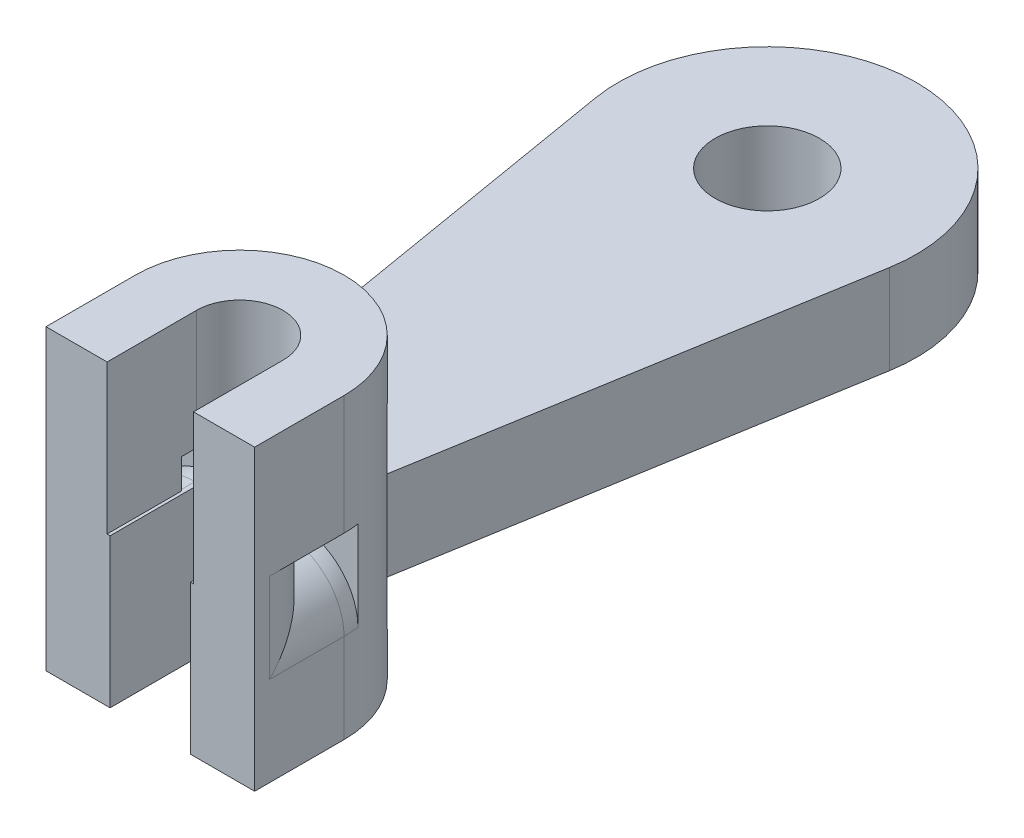
ISO-10303-21;
HEADER;
FILE_DESCRIPTION(('STEP AP214'),'2;1');
FILE_NAME('part.step','',(''),(''),'','','');
FILE_SCHEMA(('AUTOMOTIVE_DESIGN { 1 0 10303 214 1 1 1 1 }'));
ENDSEC;
DATA;
#1=APPLICATION_CONTEXT('core data for automotive mechanical design processes');
#2=APPLICATION_PROTOCOL_DEFINITION('international standard','automotive_design',2000,#1);
#3=PRODUCT_CONTEXT('',#1,'mechanical');
#4=PRODUCT('Part','Part','',(#3));
#5=PRODUCT_RELATED_PRODUCT_CATEGORY('part','',(#4));
#6=PRODUCT_DEFINITION_FORMATION('','',#4);
#7=PRODUCT_DEFINITION_CONTEXT('part definition',#1,'design');
#8=PRODUCT_DEFINITION('design','',#6,#7);
#9=PRODUCT_DEFINITION_SHAPE('','',#8);
#10=(LENGTH_UNIT() NAMED_UNIT(*) SI_UNIT(.MILLI.,.METRE.));
#11=(NAMED_UNIT(*) PLANE_ANGLE_UNIT() SI_UNIT($,.RADIAN.));
#12=(NAMED_UNIT(*) SI_UNIT($,.STERADIAN.) SOLID_ANGLE_UNIT());
#13=UNCERTAINTY_MEASURE_WITH_UNIT(LENGTH_MEASURE(1.E-05),#10,'distance_accuracy_value','');
#14=(GEOMETRIC_REPRESENTATION_CONTEXT(3) GLOBAL_UNCERTAINTY_ASSIGNED_CONTEXT((#13)) GLOBAL_UNIT_ASSIGNED_CONTEXT((#10,
#11,#12)) REPRESENTATION_CONTEXT('',''));
#15=CARTESIAN_POINT('',(0.,0.,0.));
#16=DIRECTION('',(0.,0.,1.));
#17=DIRECTION('',(1.,0.,0.));
#18=AXIS2_PLACEMENT_3D('',#15,#16,#17);
#19=CARTESIAN_POINT('',(0.,5.,0.));
#20=DIRECTION('',(0.,-1.,0.));
#21=DIRECTION('',(0.,0.,-1.));
#22=AXIS2_PLACEMENT_3D('',#19,#20,#21);
#23=CYLINDRICAL_SURFACE('',#22,3.5);
#24=DIRECTION('',(0.,-1.,0.));
#25=VECTOR('',#24,1.);
#26=CARTESIAN_POINT('',(3.46410161513775,5.,-0.500000000000001));
#27=LINE('',#26,#25);
#28=CARTESIAN_POINT('',(3.46410161513775,6.,-0.5));
#29=VERTEX_POINT('',#28);
#30=CARTESIAN_POINT('',(3.46410161513775,3.,-0.500000000000001));
#31=VERTEX_POINT('',#30);
#32=EDGE_CURVE('E321',#29,#31,#27,.T.);
#33=ORIENTED_EDGE('',*,*,#32,.T.);
#34=CARTESIAN_POINT('',(0.,3.,0.));
#35=DIRECTION('',(0.,1.,0.));
#36=DIRECTION('',(0.,0.,1.));
#37=AXIS2_PLACEMENT_3D('',#34,#35,#36);
#38=CIRCLE('',#37,3.5);
#39=CARTESIAN_POINT('',(3.5,3.,0.));
#40=VERTEX_POINT('',#39);
#41=EDGE_CURVE('E509',#31,#40,#38,.F.);
#42=ORIENTED_EDGE('',*,*,#41,.T.);
#43=DIRECTION('',(0.,-1.,0.));
#44=VECTOR('',#43,1.);
#45=CARTESIAN_POINT('',(3.5,5.,0.));
#46=LINE('',#45,#44);
#47=CARTESIAN_POINT('',(3.5,0.,0.));
#48=VERTEX_POINT('',#47);
#49=EDGE_CURVE('E439',#40,#48,#46,.T.);
#50=ORIENTED_EDGE('',*,*,#49,.T.);
#51=CARTESIAN_POINT('',(0.,0.,0.));
#52=DIRECTION('',(0.,1.,0.));
#53=DIRECTION('',(0.,0.,1.));
#54=AXIS2_PLACEMENT_3D('',#51,#52,#53);
#55=CIRCLE('',#54,3.5);
#56=CARTESIAN_POINT('',(-3.5,0.,0.));
#57=VERTEX_POINT('',#56);
#58=EDGE_CURVE('E411',#48,#57,#55,.T.);
#59=ORIENTED_EDGE('',*,*,#58,.T.);
#60=DIRECTION('',(0.,-1.,0.));
#61=VECTOR('',#60,1.);
#62=CARTESIAN_POINT('',(-3.5,5.,0.));
#63=LINE('',#62,#61);
#64=CARTESIAN_POINT('',(-3.5,3.,0.));
#65=VERTEX_POINT('',#64);
#66=EDGE_CURVE('E434',#65,#57,#63,.T.);
#67=ORIENTED_EDGE('',*,*,#66,.F.);
#68=CARTESIAN_POINT('',(0.,3.,0.));
#69=DIRECTION('',(0.,1.,0.));
#70=DIRECTION('',(0.,0.,1.));
#71=AXIS2_PLACEMENT_3D('',#68,#69,#70);
#72=CIRCLE('',#71,3.5);
#73=CARTESIAN_POINT('',(-3.46410161513775,3.,-0.500000000000001));
#74=VERTEX_POINT('',#73);
#75=EDGE_CURVE('E505',#65,#74,#72,.F.);
#76=ORIENTED_EDGE('',*,*,#75,.T.);
#77=DIRECTION('',(0.,-1.,0.));
#78=VECTOR('',#77,1.);
#79=CARTESIAN_POINT('',(-3.46410161513775,5.,-0.500000000000001));
#80=LINE('',#79,#78);
#81=CARTESIAN_POINT('',(-3.46410161513775,6.,-0.5));
#82=VERTEX_POINT('',#81);
#83=EDGE_CURVE('E317',#74,#82,#80,.F.);
#84=ORIENTED_EDGE('',*,*,#83,.T.);
#85=CARTESIAN_POINT('',(0.,6.,0.));
#86=DIRECTION('',(0.,1.,0.));
#87=DIRECTION('',(0.,0.,1.));
#88=AXIS2_PLACEMENT_3D('',#85,#86,#87);
#89=CIRCLE('',#88,3.5);
#90=CARTESIAN_POINT('',(-3.5,6.,0.));
#91=VERTEX_POINT('',#90);
#92=EDGE_CURVE('E308',#82,#91,#89,.T.);
#93=ORIENTED_EDGE('',*,*,#92,.T.);
#94=CARTESIAN_POINT('',(-3.5,10.,0.));
#95=VERTEX_POINT('',#94);
#96=EDGE_CURVE('E435',#95,#91,#63,.T.);
#97=ORIENTED_EDGE('',*,*,#96,.F.);
#98=CARTESIAN_POINT('',(0.,10.,0.));
#99=DIRECTION('',(0.,1.,0.));
#100=DIRECTION('',(0.,0.,1.));
#101=AXIS2_PLACEMENT_3D('',#98,#99,#100);
#102=CIRCLE('',#101,3.5);
#103=CARTESIAN_POINT('',(3.5,10.,0.));
#104=VERTEX_POINT('',#103);
#105=EDGE_CURVE('E343',#104,#95,#102,.T.);
#106=ORIENTED_EDGE('',*,*,#105,.F.);
#107=CARTESIAN_POINT('',(3.5,6.,0.));
#108=VERTEX_POINT('',#107);
#109=EDGE_CURVE('E440',#104,#108,#46,.T.);
#110=ORIENTED_EDGE('',*,*,#109,.T.);
#111=EDGE_CURVE('E312',#108,#29,#89,.T.);
#112=ORIENTED_EDGE('',*,*,#111,.T.);
#113=EDGE_LOOP('',(#33,#42,#50,#59,#67,#76,#84,#93,#97,#106,#110,#112));
#114=FACE_BOUND('',#113,.T.);
#115=DIRECTION('',(0.,1.,0.));
#116=VECTOR('',#115,1.);
#117=CARTESIAN_POINT('',(2.5,3.,-2.44948974278318));
#118=LINE('',#117,#116);
#119=CARTESIAN_POINT('',(2.5,3.,-2.44948974278318));
#120=VERTEX_POINT('',#119);
#121=CARTESIAN_POINT('',(2.5,6.,-2.44948974278318));
#122=VERTEX_POINT('',#121);
#123=EDGE_CURVE('E67',#120,#122,#118,.T.);
#124=ORIENTED_EDGE('',*,*,#123,.T.);
#125=CARTESIAN_POINT('',(0.,6.,0.));
#126=DIRECTION('',(0.,1.,0.));
#127=DIRECTION('',(0.,0.,-1.));
#128=AXIS2_PLACEMENT_3D('',#125,#126,#127);
#129=CIRCLE('',#128,3.5);
#130=CARTESIAN_POINT('',(-2.5,6.,-2.44948974278318));
#131=VERTEX_POINT('',#130);
#132=EDGE_CURVE('E755',#122,#131,#129,.T.);
#133=ORIENTED_EDGE('',*,*,#132,.T.);
#134=DIRECTION('',(0.,1.,0.));
#135=VECTOR('',#134,1.);
#136=CARTESIAN_POINT('',(-2.5,3.,-2.44948974278318));
#137=LINE('',#136,#135);
#138=CARTESIAN_POINT('',(-2.5,3.,-2.44948974278318));
#139=VERTEX_POINT('',#138);
#140=EDGE_CURVE('E270',#139,#131,#137,.T.);
#141=ORIENTED_EDGE('',*,*,#140,.F.);
#142=CARTESIAN_POINT('',(0.,3.,0.));
#143=DIRECTION('',(0.,1.,0.));
#144=DIRECTION('',(0.,0.,-1.));
#145=AXIS2_PLACEMENT_3D('',#142,#143,#144);
#146=CIRCLE('',#145,3.5);
#147=EDGE_CURVE('E62',#120,#139,#146,.T.);
#148=ORIENTED_EDGE('',*,*,#147,.F.);
#149=EDGE_LOOP('',(#124,#133,#141,#148));
#150=FACE_BOUND('',#149,.T.);
#151=ADVANCED_FACE('F43',(#114,#150),#23,.T.);
#152=CARTESIAN_POINT('',(0.,5.,0.));
#153=DIRECTION('',(0.,1.,0.));
#154=DIRECTION('',(0.,0.,1.));
#155=AXIS2_PLACEMENT_3D('',#152,#153,#154);
#156=PLANE('',#155);
#157=DIRECTION('',(1.,0.,0.));
#158=VECTOR('',#157,1.);
#159=CARTESIAN_POINT('',(-3.5,5.,0.5));
#160=LINE('',#159,#158);
#161=CARTESIAN_POINT('',(1.45,5.,0.5));
#162=VERTEX_POINT('',#161);
#163=CARTESIAN_POINT('',(1.5,5.,0.5));
#164=VERTEX_POINT('',#163);
#165=EDGE_CURVE('E281',#162,#164,#160,.T.);
#166=ORIENTED_EDGE('',*,*,#165,.T.);
#167=DIRECTION('',(0.,0.,-1.));
#168=VECTOR('',#167,1.);
#169=CARTESIAN_POINT('',(1.5,5.,0.));
#170=LINE('',#169,#168);
#171=CARTESIAN_POINT('',(1.5,5.,0.));
#172=VERTEX_POINT('',#171);
#173=EDGE_CURVE('E502',#164,#172,#170,.T.);
#174=ORIENTED_EDGE('',*,*,#173,.T.);
#175=CARTESIAN_POINT('',(0.,5.,0.));
#176=DIRECTION('',(0.,1.,0.));
#177=DIRECTION('',(0.,0.,1.));
#178=AXIS2_PLACEMENT_3D('',#175,#176,#177);
#179=CIRCLE('',#178,1.5);
#180=CARTESIAN_POINT('',(1.41421356237309,5.,-0.500000000000001));
#181=VERTEX_POINT('',#180);
#182=EDGE_CURVE('E499',#172,#181,#179,.T.);
#183=ORIENTED_EDGE('',*,*,#182,.T.);
#184=DIRECTION('',(1.,0.,0.));
#185=VECTOR('',#184,1.);
#186=CARTESIAN_POINT('',(-3.5,5.,-0.500000000000001));
#187=LINE('',#186,#185);
#188=CARTESIAN_POINT('',(1.36106575888162,5.,-0.500000000000001));
#189=VERTEX_POINT('',#188);
#190=EDGE_CURVE('E293',#189,#181,#187,.T.);
#191=ORIENTED_EDGE('',*,*,#190,.F.);
#192=CARTESIAN_POINT('',(0.,5.,0.));
#193=DIRECTION('',(0.,-1.,0.));
#194=DIRECTION('',(0.,0.,1.));
#195=AXIS2_PLACEMENT_3D('',#192,#193,#194);
#196=CIRCLE('',#195,1.45);
#197=CARTESIAN_POINT('',(-1.36106575888162,5.,-0.500000000000001));
#198=VERTEX_POINT('',#197);
#199=EDGE_CURVE('E358',#198,#189,#196,.T.);
#200=ORIENTED_EDGE('',*,*,#199,.F.);
#201=CARTESIAN_POINT('',(-1.41421356237309,5.,-0.500000000000001));
#202=VERTEX_POINT('',#201);
#203=EDGE_CURVE('E292',#202,#198,#187,.T.);
#204=ORIENTED_EDGE('',*,*,#203,.F.);
#205=CARTESIAN_POINT('',(0.,5.,0.));
#206=DIRECTION('',(0.,1.,0.));
#207=DIRECTION('',(0.,0.,1.));
#208=AXIS2_PLACEMENT_3D('',#205,#206,#207);
#209=CIRCLE('',#208,1.5);
#210=CARTESIAN_POINT('',(-1.5,5.,0.));
#211=VERTEX_POINT('',#210);
#212=EDGE_CURVE('E496',#202,#211,#209,.T.);
#213=ORIENTED_EDGE('',*,*,#212,.T.);
#214=DIRECTION('',(0.,0.,-1.));
#215=VECTOR('',#214,1.);
#216=CARTESIAN_POINT('',(-1.5,5.,0.5));
#217=LINE('',#216,#215);
#218=CARTESIAN_POINT('',(-1.5,5.,0.5));
#219=VERTEX_POINT('',#218);
#220=EDGE_CURVE('E493',#211,#219,#217,.F.);
#221=ORIENTED_EDGE('',*,*,#220,.T.);
#222=CARTESIAN_POINT('',(-1.45,5.,0.5));
#223=VERTEX_POINT('',#222);
#224=EDGE_CURVE('E297',#219,#223,#160,.T.);
#225=ORIENTED_EDGE('',*,*,#224,.T.);
#226=DIRECTION('',(0.,0.,-1.));
#227=VECTOR('',#226,1.);
#228=CARTESIAN_POINT('',(-1.45,5.,2.9));
#229=LINE('',#228,#227);
#230=CARTESIAN_POINT('',(-1.45,5.,3.));
#231=VERTEX_POINT('',#230);
#232=EDGE_CURVE('E324',#231,#223,#229,.T.);
#233=ORIENTED_EDGE('',*,*,#232,.F.);
#234=DIRECTION('',(1.,0.,0.));
#235=VECTOR('',#234,1.);
#236=CARTESIAN_POINT('',(-1.35,5.,3.));
#237=LINE('',#236,#235);
#238=CARTESIAN_POINT('',(-1.35,5.,3.));
#239=VERTEX_POINT('',#238);
#240=EDGE_CURVE('E391',#231,#239,#237,.T.);
#241=ORIENTED_EDGE('',*,*,#240,.T.);
#242=DIRECTION('',(0.,0.,-1.));
#243=VECTOR('',#242,1.);
#244=CARTESIAN_POINT('',(-1.35,5.,0.));
#245=LINE('',#244,#243);
#246=CARTESIAN_POINT('',(-1.35,5.,0.));
#247=VERTEX_POINT('',#246);
#248=EDGE_CURVE('E394',#239,#247,#245,.T.);
#249=ORIENTED_EDGE('',*,*,#248,.T.);
#250=CARTESIAN_POINT('',(0.,5.,0.));
#251=DIRECTION('',(0.,-1.,0.));
#252=DIRECTION('',(0.,0.,1.));
#253=AXIS2_PLACEMENT_3D('',#250,#251,#252);
#254=CIRCLE('',#253,1.35);
#255=CARTESIAN_POINT('',(1.35,5.,0.));
#256=VERTEX_POINT('',#255);
#257=EDGE_CURVE('E380',#247,#256,#254,.T.);
#258=ORIENTED_EDGE('',*,*,#257,.T.);
#259=DIRECTION('',(0.,0.,1.));
#260=VECTOR('',#259,1.);
#261=CARTESIAN_POINT('',(1.35,5.,0.));
#262=LINE('',#261,#260);
#263=CARTESIAN_POINT('',(1.35,5.,3.));
#264=VERTEX_POINT('',#263);
#265=EDGE_CURVE('E383',#256,#264,#262,.T.);
#266=ORIENTED_EDGE('',*,*,#265,.T.);
#267=DIRECTION('',(1.,0.,0.));
#268=VECTOR('',#267,1.);
#269=CARTESIAN_POINT('',(3.5,5.,3.));
#270=LINE('',#269,#268);
#271=CARTESIAN_POINT('',(1.45,5.,3.));
#272=VERTEX_POINT('',#271);
#273=EDGE_CURVE('E387',#264,#272,#270,.T.);
#274=ORIENTED_EDGE('',*,*,#273,.T.);
#275=DIRECTION('',(0.,0.,1.));
#276=VECTOR('',#275,1.);
#277=CARTESIAN_POINT('',(1.45,5.,2.9));
#278=LINE('',#277,#276);
#279=EDGE_CURVE('E329',#162,#272,#278,.T.);
#280=ORIENTED_EDGE('',*,*,#279,.F.);
#281=EDGE_LOOP('',(#166,#174,#183,#191,#200,#204,#213,#221,#225,#233,#241,#249,#258,#266,#274,#280));
#282=FACE_BOUND('',#281,.T.);
#283=ADVANCED_FACE('F558',(#282),#156,.T.);
#284=CARTESIAN_POINT('',(0.,5.,0.));
#285=DIRECTION('',(0.,-1.,0.));
#286=DIRECTION('',(0.,0.,-1.));
#287=AXIS2_PLACEMENT_3D('',#284,#285,#286);
#288=CYLINDRICAL_SURFACE('',#287,1.35);
#289=CARTESIAN_POINT('',(0.,0.,0.));
#290=DIRECTION('',(0.,-1.,0.));
#291=DIRECTION('',(0.,0.,1.));
#292=AXIS2_PLACEMENT_3D('',#289,#290,#291);
#293=CIRCLE('',#292,1.35);
#294=CARTESIAN_POINT('',(-1.35,0.,0.));
#295=VERTEX_POINT('',#294);
#296=CARTESIAN_POINT('',(1.35,0.,0.));
#297=VERTEX_POINT('',#296);
#298=EDGE_CURVE('E379',#295,#297,#293,.T.);
#299=ORIENTED_EDGE('',*,*,#298,.T.);
#300=DIRECTION('',(0.,-1.,0.));
#301=VECTOR('',#300,1.);
#302=CARTESIAN_POINT('',(1.35,5.,0.));
#303=LINE('',#302,#301);
#304=EDGE_CURVE('E452',#256,#297,#303,.T.);
#305=ORIENTED_EDGE('',*,*,#304,.F.);
#306=ORIENTED_EDGE('',*,*,#257,.F.);
#307=DIRECTION('',(0.,-1.,0.));
#308=VECTOR('',#307,1.);
#309=CARTESIAN_POINT('',(-1.35,5.,0.));
#310=LINE('',#309,#308);
#311=EDGE_CURVE('E397',#247,#295,#310,.T.);
#312=ORIENTED_EDGE('',*,*,#311,.T.);
#313=EDGE_LOOP('',(#299,#305,#306,#312));
#314=FACE_BOUND('',#313,.T.);
#315=ADVANCED_FACE('F564',(#314),#288,.F.);
#316=CARTESIAN_POINT('',(1.35,5.,0.));
#317=DIRECTION('',(1.,0.,0.));
#318=DIRECTION('',(0.,0.,-1.));
#319=AXIS2_PLACEMENT_3D('',#316,#317,#318);
#320=PLANE('',#319);
#321=DIRECTION('',(0.,0.,1.));
#322=VECTOR('',#321,1.);
#323=CARTESIAN_POINT('',(1.35,0.,0.));
#324=LINE('',#323,#322);
#325=CARTESIAN_POINT('',(1.35,0.,3.));
#326=VERTEX_POINT('',#325);
#327=EDGE_CURVE('E401',#297,#326,#324,.T.);
#328=ORIENTED_EDGE('',*,*,#327,.T.);
#329=DIRECTION('',(0.,-1.,0.));
#330=VECTOR('',#329,1.);
#331=CARTESIAN_POINT('',(1.35,5.,3.));
#332=LINE('',#331,#330);
#333=EDGE_CURVE('E448',#264,#326,#332,.T.);
#334=ORIENTED_EDGE('',*,*,#333,.F.);
#335=ORIENTED_EDGE('',*,*,#265,.F.);
#336=ORIENTED_EDGE('',*,*,#304,.T.);
#337=EDGE_LOOP('',(#328,#334,#335,#336));
#338=FACE_BOUND('',#337,.T.);
#339=ADVANCED_FACE('F578',(#338),#320,.F.);
#340=CARTESIAN_POINT('',(3.5,5.,3.));
#341=DIRECTION('',(0.,0.,-1.));
#342=DIRECTION('',(-1.,0.,0.));
#343=AXIS2_PLACEMENT_3D('',#340,#341,#342);
#344=PLANE('',#343);
#345=DIRECTION('',(1.,0.,0.));
#346=VECTOR('',#345,1.);
#347=CARTESIAN_POINT('',(3.5,0.,3.));
#348=LINE('',#347,#346);
#349=CARTESIAN_POINT('',(3.5,0.,3.));
#350=VERTEX_POINT('',#349);
#351=EDGE_CURVE('E404',#326,#350,#348,.T.);
#352=ORIENTED_EDGE('',*,*,#351,.T.);
#353=DIRECTION('',(0.,-1.,0.));
#354=VECTOR('',#353,1.);
#355=CARTESIAN_POINT('',(3.5,5.,3.));
#356=LINE('',#355,#354);
#357=CARTESIAN_POINT('',(3.5,10.,3.));
#358=VERTEX_POINT('',#357);
#359=EDGE_CURVE('E444',#358,#350,#356,.T.);
#360=ORIENTED_EDGE('',*,*,#359,.F.);
#361=DIRECTION('',(1.,0.,0.));
#362=VECTOR('',#361,1.);
#363=CARTESIAN_POINT('',(1.45,10.,3.));
#364=LINE('',#363,#362);
#365=CARTESIAN_POINT('',(1.45,10.,3.));
#366=VERTEX_POINT('',#365);
#367=EDGE_CURVE('E335',#366,#358,#364,.T.);
#368=ORIENTED_EDGE('',*,*,#367,.F.);
#369=DIRECTION('',(0.,-1.,0.));
#370=VECTOR('',#369,1.);
#371=CARTESIAN_POINT('',(1.45,10.,3.));
#372=LINE('',#371,#370);
#373=EDGE_CURVE('E367',#366,#272,#372,.T.);
#374=ORIENTED_EDGE('',*,*,#373,.T.);
#375=ORIENTED_EDGE('',*,*,#273,.F.);
#376=ORIENTED_EDGE('',*,*,#333,.T.);
#377=EDGE_LOOP('',(#352,#360,#368,#374,#375,#376));
#378=FACE_BOUND('',#377,.T.);
#379=ADVANCED_FACE('F574',(#378),#344,.F.);
#380=CARTESIAN_POINT('',(3.5,5.,0.));
#381=DIRECTION('',(-1.,0.,0.));
#382=DIRECTION('',(0.,0.,1.));
#383=AXIS2_PLACEMENT_3D('',#380,#381,#382);
#384=PLANE('',#383);
#385=DIRECTION('',(0.,-1.,0.));
#386=VECTOR('',#385,1.);
#387=CARTESIAN_POINT('',(3.5,5.,2.5));
#388=LINE('',#387,#386);
#389=CARTESIAN_POINT('',(3.5,3.,2.5));
#390=VERTEX_POINT('',#389);
#391=CARTESIAN_POINT('',(3.5,6.,2.5));
#392=VERTEX_POINT('',#391);
#393=EDGE_CURVE('E479',#390,#392,#388,.F.);
#394=ORIENTED_EDGE('',*,*,#393,.T.);
#395=DIRECTION('',(0.,0.,1.));
#396=VECTOR('',#395,1.);
#397=CARTESIAN_POINT('',(3.5,6.,0.5));
#398=LINE('',#397,#396);
#399=EDGE_CURVE('E274',#108,#392,#398,.T.);
#400=ORIENTED_EDGE('',*,*,#399,.F.);
#401=ORIENTED_EDGE('',*,*,#109,.F.);
#402=DIRECTION('',(0.,0.,-1.));
#403=VECTOR('',#402,1.);
#404=CARTESIAN_POINT('',(3.5,10.,3.));
#405=LINE('',#404,#403);
#406=EDGE_CURVE('E339',#358,#104,#405,.T.);
#407=ORIENTED_EDGE('',*,*,#406,.F.);
#408=ORIENTED_EDGE('',*,*,#359,.T.);
#409=DIRECTION('',(0.,0.,-1.));
#410=VECTOR('',#409,1.);
#411=CARTESIAN_POINT('',(3.5,0.,0.));
#412=LINE('',#411,#410);
#413=EDGE_CURVE('E407',#350,#48,#412,.T.);
#414=ORIENTED_EDGE('',*,*,#413,.T.);
#415=ORIENTED_EDGE('',*,*,#49,.F.);
#416=DIRECTION('',(0.,0.,-1.));
#417=VECTOR('',#416,1.);
#418=CARTESIAN_POINT('',(3.5,3.,0.5));
#419=LINE('',#418,#417);
#420=EDGE_CURVE('E476',#40,#390,#419,.F.);
#421=ORIENTED_EDGE('',*,*,#420,.T.);
#422=EDGE_LOOP('',(#394,#400,#401,#407,#408,#414,#415,#421));
#423=FACE_BOUND('',#422,.T.);
#424=ADVANCED_FACE('F571',(#423),#384,.F.);
#425=CARTESIAN_POINT('',(-3.5,5.,0.));
#426=DIRECTION('',(1.,0.,0.));
#427=DIRECTION('',(0.,0.,-1.));
#428=AXIS2_PLACEMENT_3D('',#425,#426,#427);
#429=PLANE('',#428);
#430=DIRECTION('',(0.,0.,1.));
#431=VECTOR('',#430,1.);
#432=CARTESIAN_POINT('',(-3.5,6.,0.5));
#433=LINE('',#432,#431);
#434=CARTESIAN_POINT('',(-3.5,6.,2.5));
#435=VERTEX_POINT('',#434);
#436=EDGE_CURVE('E277',#91,#435,#433,.T.);
#437=ORIENTED_EDGE('',*,*,#436,.T.);
#438=DIRECTION('',(0.,-1.,0.));
#439=VECTOR('',#438,1.);
#440=CARTESIAN_POINT('',(-3.5,5.,2.5));
#441=LINE('',#440,#439);
#442=CARTESIAN_POINT('',(-3.5,3.,2.5));
#443=VERTEX_POINT('',#442);
#444=EDGE_CURVE('E486',#435,#443,#441,.T.);
#445=ORIENTED_EDGE('',*,*,#444,.T.);
#446=DIRECTION('',(0.,0.,-1.));
#447=VECTOR('',#446,1.);
#448=CARTESIAN_POINT('',(-3.5,3.,0.));
#449=LINE('',#448,#447);
#450=EDGE_CURVE('E483',#443,#65,#449,.T.);
#451=ORIENTED_EDGE('',*,*,#450,.T.);
#452=ORIENTED_EDGE('',*,*,#66,.T.);
#453=DIRECTION('',(0.,0.,1.));
#454=VECTOR('',#453,1.);
#455=CARTESIAN_POINT('',(-3.5,0.,0.));
#456=LINE('',#455,#454);
#457=CARTESIAN_POINT('',(-3.5,0.,3.));
#458=VERTEX_POINT('',#457);
#459=EDGE_CURVE('E415',#57,#458,#456,.T.);
#460=ORIENTED_EDGE('',*,*,#459,.T.);
#461=DIRECTION('',(0.,-1.,0.));
#462=VECTOR('',#461,1.);
#463=CARTESIAN_POINT('',(-3.5,5.,3.));
#464=LINE('',#463,#462);
#465=CARTESIAN_POINT('',(-3.5,10.,3.));
#466=VERTEX_POINT('',#465);
#467=EDGE_CURVE('E430',#466,#458,#464,.T.);
#468=ORIENTED_EDGE('',*,*,#467,.F.);
#469=DIRECTION('',(0.,0.,1.));
#470=VECTOR('',#469,1.);
#471=CARTESIAN_POINT('',(-3.5,10.,0.));
#472=LINE('',#471,#470);
#473=EDGE_CURVE('E347',#95,#466,#472,.T.);
#474=ORIENTED_EDGE('',*,*,#473,.F.);
#475=ORIENTED_EDGE('',*,*,#96,.T.);
#476=EDGE_LOOP('',(#437,#445,#451,#452,#460,#468,#474,#475));
#477=FACE_BOUND('',#476,.T.);
#478=ADVANCED_FACE('F569',(#477),#429,.F.);
#479=CARTESIAN_POINT('',(-1.35,5.,3.));
#480=DIRECTION('',(0.,0.,-1.));
#481=DIRECTION('',(-1.,0.,0.));
#482=AXIS2_PLACEMENT_3D('',#479,#480,#481);
#483=PLANE('',#482);
#484=DIRECTION('',(1.,0.,0.));
#485=VECTOR('',#484,1.);
#486=CARTESIAN_POINT('',(-1.35,0.,3.));
#487=LINE('',#486,#485);
#488=CARTESIAN_POINT('',(-1.35,0.,3.));
#489=VERTEX_POINT('',#488);
#490=EDGE_CURVE('E418',#458,#489,#487,.T.);
#491=ORIENTED_EDGE('',*,*,#490,.T.);
#492=DIRECTION('',(0.,-1.,0.));
#493=VECTOR('',#492,1.);
#494=CARTESIAN_POINT('',(-1.35,5.,3.));
#495=LINE('',#494,#493);
#496=EDGE_CURVE('E426',#239,#489,#495,.T.);
#497=ORIENTED_EDGE('',*,*,#496,.F.);
#498=ORIENTED_EDGE('',*,*,#240,.F.);
#499=DIRECTION('',(0.,-1.,0.));
#500=VECTOR('',#499,1.);
#501=CARTESIAN_POINT('',(-1.45,10.,3.));
#502=LINE('',#501,#500);
#503=CARTESIAN_POINT('',(-1.45,10.,3.));
#504=VERTEX_POINT('',#503);
#505=EDGE_CURVE('E354',#504,#231,#502,.T.);
#506=ORIENTED_EDGE('',*,*,#505,.F.);
#507=DIRECTION('',(1.,0.,0.));
#508=VECTOR('',#507,1.);
#509=CARTESIAN_POINT('',(-3.5,10.,3.));
#510=LINE('',#509,#508);
#511=EDGE_CURVE('E351',#466,#504,#510,.T.);
#512=ORIENTED_EDGE('',*,*,#511,.F.);
#513=ORIENTED_EDGE('',*,*,#467,.T.);
#514=EDGE_LOOP('',(#491,#497,#498,#506,#512,#513));
#515=FACE_BOUND('',#514,.T.);
#516=ADVANCED_FACE('F639',(#515),#483,.F.);
#517=CARTESIAN_POINT('',(-1.35,5.,0.));
#518=DIRECTION('',(-1.,0.,0.));
#519=DIRECTION('',(0.,0.,1.));
#520=AXIS2_PLACEMENT_3D('',#517,#518,#519);
#521=PLANE('',#520);
#522=DIRECTION('',(0.,0.,-1.));
#523=VECTOR('',#522,1.);
#524=CARTESIAN_POINT('',(-1.35,0.,0.));
#525=LINE('',#524,#523);
#526=EDGE_CURVE('E384',#489,#295,#525,.T.);
#527=ORIENTED_EDGE('',*,*,#526,.T.);
#528=ORIENTED_EDGE('',*,*,#311,.F.);
#529=ORIENTED_EDGE('',*,*,#248,.F.);
#530=ORIENTED_EDGE('',*,*,#496,.T.);
#531=EDGE_LOOP('',(#527,#528,#529,#530));
#532=FACE_BOUND('',#531,.T.);
#533=ADVANCED_FACE('F673',(#532),#521,.F.);
#534=CARTESIAN_POINT('',(0.,0.,0.));
#535=DIRECTION('',(0.,1.,0.));
#536=DIRECTION('',(0.,0.,1.));
#537=AXIS2_PLACEMENT_3D('',#534,#535,#536);
#538=PLANE('',#537);
#539=ORIENTED_EDGE('',*,*,#298,.F.);
#540=ORIENTED_EDGE('',*,*,#526,.F.);
#541=ORIENTED_EDGE('',*,*,#490,.F.);
#542=ORIENTED_EDGE('',*,*,#459,.F.);
#543=ORIENTED_EDGE('',*,*,#58,.F.);
#544=ORIENTED_EDGE('',*,*,#413,.F.);
#545=ORIENTED_EDGE('',*,*,#351,.F.);
#546=ORIENTED_EDGE('',*,*,#327,.F.);
#547=EDGE_LOOP('',(#539,#540,#541,#542,#543,#544,#545,#546));
#548=FACE_BOUND('',#547,.T.);
#549=ADVANCED_FACE('F632',(#548),#538,.F.);
#550=CARTESIAN_POINT('',(-1.45,10.,2.9));
#551=DIRECTION('',(-1.,0.,0.));
#552=DIRECTION('',(0.,0.,1.));
#553=AXIS2_PLACEMENT_3D('',#550,#551,#552);
#554=PLANE('',#553);
#555=ORIENTED_EDGE('',*,*,#232,.T.);
#556=DIRECTION('',(0.,1.,0.));
#557=VECTOR('',#556,1.);
#558=CARTESIAN_POINT('',(-1.45,10.,0.5));
#559=LINE('',#558,#557);
#560=CARTESIAN_POINT('',(-1.45,6.,0.5));
#561=VERTEX_POINT('',#560);
#562=EDGE_CURVE('E313',#223,#561,#559,.T.);
#563=ORIENTED_EDGE('',*,*,#562,.T.);
#564=DIRECTION('',(0.,0.,-1.));
#565=VECTOR('',#564,1.);
#566=CARTESIAN_POINT('',(-1.45,6.,2.9));
#567=LINE('',#566,#565);
#568=CARTESIAN_POINT('',(-1.45,6.,0.));
#569=VERTEX_POINT('',#568);
#570=EDGE_CURVE('E304',#561,#569,#567,.T.);
#571=ORIENTED_EDGE('',*,*,#570,.T.);
#572=DIRECTION('',(0.,-1.,0.));
#573=VECTOR('',#572,1.);
#574=CARTESIAN_POINT('',(-1.45,10.,0.));
#575=LINE('',#574,#573);
#576=CARTESIAN_POINT('',(-1.45,10.,0.));
#577=VERTEX_POINT('',#576);
#578=EDGE_CURVE('E375',#577,#569,#575,.T.);
#579=ORIENTED_EDGE('',*,*,#578,.F.);
#580=DIRECTION('',(0.,0.,-1.));
#581=VECTOR('',#580,1.);
#582=CARTESIAN_POINT('',(-1.45,10.,2.9));
#583=LINE('',#582,#581);
#584=EDGE_CURVE('E325',#504,#577,#583,.T.);
#585=ORIENTED_EDGE('',*,*,#584,.F.);
#586=ORIENTED_EDGE('',*,*,#505,.T.);
#587=EDGE_LOOP('',(#555,#563,#571,#579,#585,#586));
#588=FACE_BOUND('',#587,.T.);
#589=ADVANCED_FACE('F669',(#588),#554,.F.);
#590=CARTESIAN_POINT('',(0.,10.,0.));
#591=DIRECTION('',(0.,-1.,0.));
#592=DIRECTION('',(0.,0.,-1.));
#593=AXIS2_PLACEMENT_3D('',#590,#591,#592);
#594=CYLINDRICAL_SURFACE('',#593,1.45);
#595=DIRECTION('',(0.,-1.,0.));
#596=VECTOR('',#595,1.);
#597=CARTESIAN_POINT('',(1.36106575888162,10.,-0.499999999999997));
#598=LINE('',#597,#596);
#599=CARTESIAN_POINT('',(1.36106575888162,6.,-0.5));
#600=VERTEX_POINT('',#599);
#601=EDGE_CURVE('E468',#189,#600,#598,.F.);
#602=ORIENTED_EDGE('',*,*,#601,.T.);
#603=CARTESIAN_POINT('',(0.,6.,0.));
#604=DIRECTION('',(0.,1.,0.));
#605=DIRECTION('',(0.,0.,1.));
#606=AXIS2_PLACEMENT_3D('',#603,#604,#605);
#607=CIRCLE('',#606,1.45);
#608=CARTESIAN_POINT('',(1.45,6.,0.));
#609=VERTEX_POINT('',#608);
#610=EDGE_CURVE('E285',#600,#609,#607,.F.);
#611=ORIENTED_EDGE('',*,*,#610,.T.);
#612=DIRECTION('',(0.,-1.,0.));
#613=VECTOR('',#612,1.);
#614=CARTESIAN_POINT('',(1.45,10.,0.));
#615=LINE('',#614,#613);
#616=CARTESIAN_POINT('',(1.45,10.,0.));
#617=VERTEX_POINT('',#616);
#618=EDGE_CURVE('E371',#617,#609,#615,.T.);
#619=ORIENTED_EDGE('',*,*,#618,.F.);
#620=CARTESIAN_POINT('',(0.,10.,0.));
#621=DIRECTION('',(0.,-1.,0.));
#622=DIRECTION('',(0.,0.,1.));
#623=AXIS2_PLACEMENT_3D('',#620,#621,#622);
#624=CIRCLE('',#623,1.45);
#625=EDGE_CURVE('E328',#577,#617,#624,.T.);
#626=ORIENTED_EDGE('',*,*,#625,.F.);
#627=ORIENTED_EDGE('',*,*,#578,.T.);
#628=CARTESIAN_POINT('',(-1.36106575888162,6.,-0.5));
#629=VERTEX_POINT('',#628);
#630=EDGE_CURVE('E303',#569,#629,#607,.F.);
#631=ORIENTED_EDGE('',*,*,#630,.T.);
#632=DIRECTION('',(0.,-1.,0.));
#633=VECTOR('',#632,1.);
#634=CARTESIAN_POINT('',(-1.36106575888162,10.,-0.499999999999997));
#635=LINE('',#634,#633);
#636=EDGE_CURVE('E464',#629,#198,#635,.T.);
#637=ORIENTED_EDGE('',*,*,#636,.T.);
#638=ORIENTED_EDGE('',*,*,#199,.T.);
#639=EDGE_LOOP('',(#602,#611,#619,#626,#627,#631,#637,#638));
#640=FACE_BOUND('',#639,.T.);
#641=ADVANCED_FACE('F612',(#640),#594,.F.);
#642=CARTESIAN_POINT('',(1.45,10.,2.9));
#643=DIRECTION('',(1.,0.,0.));
#644=DIRECTION('',(0.,0.,-1.));
#645=AXIS2_PLACEMENT_3D('',#642,#643,#644);
#646=PLANE('',#645);
#647=DIRECTION('',(0.,0.,1.));
#648=VECTOR('',#647,1.);
#649=CARTESIAN_POINT('',(1.45,6.,2.9));
#650=LINE('',#649,#648);
#651=CARTESIAN_POINT('',(1.45,6.,0.5));
#652=VERTEX_POINT('',#651);
#653=EDGE_CURVE('E456',#609,#652,#650,.T.);
#654=ORIENTED_EDGE('',*,*,#653,.T.);
#655=DIRECTION('',(0.,-1.,0.));
#656=VECTOR('',#655,1.);
#657=CARTESIAN_POINT('',(1.45,10.,0.5));
#658=LINE('',#657,#656);
#659=EDGE_CURVE('E460',#652,#162,#658,.T.);
#660=ORIENTED_EDGE('',*,*,#659,.T.);
#661=ORIENTED_EDGE('',*,*,#279,.T.);
#662=ORIENTED_EDGE('',*,*,#373,.F.);
#663=DIRECTION('',(0.,0.,1.));
#664=VECTOR('',#663,1.);
#665=CARTESIAN_POINT('',(1.45,10.,0.));
#666=LINE('',#665,#664);
#667=EDGE_CURVE('E332',#617,#366,#666,.T.);
#668=ORIENTED_EDGE('',*,*,#667,.F.);
#669=ORIENTED_EDGE('',*,*,#618,.T.);
#670=EDGE_LOOP('',(#654,#660,#661,#662,#668,#669));
#671=FACE_BOUND('',#670,.T.);
#672=ADVANCED_FACE('F683',(#671),#646,.F.);
#673=CARTESIAN_POINT('',(0.,10.,0.));
#674=DIRECTION('',(0.,1.,0.));
#675=DIRECTION('',(0.,0.,1.));
#676=AXIS2_PLACEMENT_3D('',#673,#674,#675);
#677=PLANE('',#676);
#678=ORIENTED_EDGE('',*,*,#584,.T.);
#679=ORIENTED_EDGE('',*,*,#625,.T.);
#680=ORIENTED_EDGE('',*,*,#667,.T.);
#681=ORIENTED_EDGE('',*,*,#367,.T.);
#682=ORIENTED_EDGE('',*,*,#406,.T.);
#683=ORIENTED_EDGE('',*,*,#105,.T.);
#684=ORIENTED_EDGE('',*,*,#473,.T.);
#685=ORIENTED_EDGE('',*,*,#511,.T.);
#686=EDGE_LOOP('',(#678,#679,#680,#681,#682,#683,#684,#685));
#687=FACE_BOUND('',#686,.T.);
#688=ADVANCED_FACE('F645',(#687),#677,.T.);
#689=CARTESIAN_POINT('',(-3.5,6.,0.5));
#690=DIRECTION('',(0.,1.,0.));
#691=DIRECTION('',(0.,0.,1.));
#692=AXIS2_PLACEMENT_3D('',#689,#690,#691);
#693=PLANE('',#692);
#694=ORIENTED_EDGE('',*,*,#399,.T.);
#695=CARTESIAN_POINT('',(1.5,6.,2.5));
#696=DIRECTION('',(0.,1.,0.));
#697=DIRECTION('',(0.,0.,1.));
#698=AXIS2_PLACEMENT_3D('',#695,#696,#697);
#699=CIRCLE('',#698,2.);
#700=CARTESIAN_POINT('',(1.5,6.,0.5));
#701=VERTEX_POINT('',#700);
#702=EDGE_CURVE('E512',#392,#701,#699,.T.);
#703=ORIENTED_EDGE('',*,*,#702,.T.);
#704=DIRECTION('',(1.,0.,0.));
#705=VECTOR('',#704,1.);
#706=CARTESIAN_POINT('',(-3.5,6.,0.5));
#707=LINE('',#706,#705);
#708=EDGE_CURVE('E286',#652,#701,#707,.T.);
#709=ORIENTED_EDGE('',*,*,#708,.F.);
#710=ORIENTED_EDGE('',*,*,#653,.F.);
#711=ORIENTED_EDGE('',*,*,#610,.F.);
#712=DIRECTION('',(1.,0.,0.));
#713=VECTOR('',#712,1.);
#714=CARTESIAN_POINT('',(-3.5,6.,-0.5));
#715=LINE('',#714,#713);
#716=EDGE_CURVE('E287',#600,#29,#715,.T.);
#717=ORIENTED_EDGE('',*,*,#716,.T.);
#718=ORIENTED_EDGE('',*,*,#111,.F.);
#719=EDGE_LOOP('',(#694,#703,#709,#710,#711,#717,#718));
#720=FACE_BOUND('',#719,.T.);
#721=ADVANCED_FACE('F598',(#720),#693,.F.);
#722=CARTESIAN_POINT('',(-3.5,5.,0.5));
#723=DIRECTION('',(0.,0.,1.));
#724=DIRECTION('',(0.,-1.,0.));
#725=AXIS2_PLACEMENT_3D('',#722,#723,#724);
#726=PLANE('',#725);
#727=ORIENTED_EDGE('',*,*,#708,.T.);
#728=DIRECTION('',(0.,-1.,0.));
#729=VECTOR('',#728,1.);
#730=CARTESIAN_POINT('',(1.5,5.,0.5));
#731=LINE('',#730,#729);
#732=EDGE_CURVE('E472',#701,#164,#731,.T.);
#733=ORIENTED_EDGE('',*,*,#732,.T.);
#734=ORIENTED_EDGE('',*,*,#165,.F.);
#735=ORIENTED_EDGE('',*,*,#659,.F.);
#736=EDGE_LOOP('',(#727,#733,#734,#735));
#737=FACE_BOUND('',#736,.T.);
#738=ADVANCED_FACE('F601',(#737),#726,.F.);
#739=CARTESIAN_POINT('',(-3.5,5.,-0.500000000000001));
#740=DIRECTION('',(0.,0.,-1.));
#741=DIRECTION('',(0.,1.,0.));
#742=AXIS2_PLACEMENT_3D('',#739,#740,#741);
#743=PLANE('',#742);
#744=ORIENTED_EDGE('',*,*,#716,.F.);
#745=ORIENTED_EDGE('',*,*,#601,.F.);
#746=ORIENTED_EDGE('',*,*,#190,.T.);
#747=CARTESIAN_POINT('',(1.41421356237309,5.,-0.500000000000001));
#748=CARTESIAN_POINT('',(1.47532594830331,5.00001589876809,-0.500000000000001));
#749=CARTESIAN_POINT('',(1.53644855060124,4.99750935824435,-0.500000000000001));
#750=CARTESIAN_POINT('',(1.6582850761892,4.9873601384161,-0.500000000000001));
#751=CARTESIAN_POINT('',(1.71899885277917,4.9797157053223,-0.500000000000001));
#752=CARTESIAN_POINT('',(1.83958166888221,4.95919327974212,-0.500000000000001));
#753=CARTESIAN_POINT('',(1.89945019116257,4.9463122152127,-0.500000000000001));
#754=CARTESIAN_POINT('',(2.01779906635164,4.91534686283674,-0.500000000000001));
#755=CARTESIAN_POINT('',(2.07627962920766,4.89726336742738,-0.500000000000001));
#756=CARTESIAN_POINT('',(2.24682604222185,4.83604794623438,-0.500000000000001));
#757=CARTESIAN_POINT('',(2.35635603180112,4.7855488128784,-0.500000000000001));
#758=CARTESIAN_POINT('',(2.56460272507372,4.66602874441364,-0.500000000000001));
#759=CARTESIAN_POINT('',(2.66332968048573,4.59702558744526,-0.500000000000001));
#760=CARTESIAN_POINT('',(2.84240259073025,4.44629586499979,-0.500000000000001));
#761=CARTESIAN_POINT('',(2.92341130997344,4.36535649836965,-0.500000000000001));
#762=CARTESIAN_POINT('',(3.0704447430899,4.1907935732014,-0.500000000000002));
#763=CARTESIAN_POINT('',(3.13646481502815,4.0971660994949,-0.500000000000002));
#764=CARTESIAN_POINT('',(3.2505487525966,3.90158388356793,-0.500000000000002));
#765=CARTESIAN_POINT('',(3.29888432986171,3.79978728598017,-0.500000000000002));
#766=CARTESIAN_POINT('',(3.3776140677028,3.58953078696064,-0.500000000000002));
#767=CARTESIAN_POINT('',(3.40802523955129,3.48107731159148,-0.500000000000002));
#768=CARTESIAN_POINT('',(3.4407078764991,3.30977468554796,-0.500000000000002));
#769=CARTESIAN_POINT('',(3.44947908405086,3.24809611559869,-0.500000000000002));
#770=CARTESIAN_POINT('',(3.46117223007642,3.12428780049203,-0.500000000000002));
#771=CARTESIAN_POINT('',(3.4641036179727,3.06215894773036,-0.500000000000002));
#772=CARTESIAN_POINT('',(3.46410161513775,3.,-0.500000000000002));
#773=B_SPLINE_CURVE_WITH_KNOTS('',3,(#747,#748,#749,#750,#751,#752,#753,#754,#755,#756,#757,
#758,#759,#760,#761,#762,#763,#764,#765,#766,#767,#768,#769,#770,#771,#772),.UNSPECIFIED.,.F.,
.F.,(4,2,2,2,2,2,2,2,2,2,2,2,4),(0.,0.183299000550526,0.36666060093054,0.550129925037778,
0.733571317778033,1.09337251344475,1.45282925324173,1.79470813144336,2.13669274442128,
2.4731772423827,2.8093418812006,2.9959924804928,3.18234081401252),.UNSPECIFIED.);
#774=EDGE_CURVE('E54',#181,#31,#773,.T.);
#775=ORIENTED_EDGE('',*,*,#774,.T.);
#776=ORIENTED_EDGE('',*,*,#32,.F.);
#777=EDGE_LOOP('',(#744,#745,#746,#775,#776));
#778=FACE_BOUND('',#777,.T.);
#779=ADVANCED_FACE('F532',(#778),#743,.F.);
#780=ORIENTED_EDGE('',*,*,#83,.F.);
#781=CARTESIAN_POINT('',(-3.46410161513775,3.,-0.500000000000001));
#782=CARTESIAN_POINT('',(-3.46410137257728,3.05577057175878,-0.500000000000002));
#783=CARTESIAN_POINT('',(-3.46174318093973,3.11151436024526,-0.500000000000002));
#784=CARTESIAN_POINT('',(-3.45233629575416,3.22260147813699,-0.500000000000002));
#785=CARTESIAN_POINT('',(-3.44528787128952,3.27794483033155,-0.500000000000002));
#786=CARTESIAN_POINT('',(-3.41717977831318,3.44265936730313,-0.500000000000002));
#787=CARTESIAN_POINT('',(-3.38915706948343,3.55092474011738,-0.500000000000002));
#788=CARTESIAN_POINT('',(-3.3153416120586,3.76120671145025,-0.500000000000002));
#789=CARTESIAN_POINT('',(-3.26954118404906,3.86322058743892,-0.500000000000002));
#790=CARTESIAN_POINT('',(-3.16150407648538,4.05814074583595,-0.500000000000002));
#791=CARTESIAN_POINT('',(-3.09926875832868,4.15104778174315,-0.500000000000001));
#792=CARTESIAN_POINT('',(-2.95999412380224,4.32537993712176,-0.500000000000001));
#793=CARTESIAN_POINT('',(-2.8829184439564,4.40677598338532,-0.500000000000001));
#794=CARTESIAN_POINT('',(-2.7162963991098,4.55559906687536,-0.500000000000001));
#795=CARTESIAN_POINT('',(-2.62674995069389,4.62302601065707,-0.500000000000001));
#796=CARTESIAN_POINT('',(-2.43695899694925,4.74266723336868,-0.500000000000001));
#797=CARTESIAN_POINT('',(-2.33662987821968,4.79474706619187,-0.500000000000001));
#798=CARTESIAN_POINT('',(-2.12875233134873,4.88170114263961,-0.500000000000001));
#799=CARTESIAN_POINT('',(-2.0212032439215,4.91657381257095,-0.500000000000001));
#800=CARTESIAN_POINT('',(-1.83012742412872,4.96186390106005,-0.500000000000001));
#801=CARTESIAN_POINT('',(-1.74751309657967,4.97625936955223,-0.500000000000001));
#802=CARTESIAN_POINT('',(-1.58133250632311,4.99534112205795,-0.500000000000001));
#803=CARTESIAN_POINT('',(-1.49776847216959,5.00004672339188,-0.500000000000001));
#804=CARTESIAN_POINT('',(-1.41421356237309,5.,-0.500000000000001));
#805=B_SPLINE_CURVE_WITH_KNOTS('',3,(#781,#782,#783,#784,#785,#786,#787,#788,#789,#790,#791,
#792,#793,#794,#795,#796,#797,#798,#799,#800,#801,#802,#803,#804),.UNSPECIFIED.,.F.,.F.,(4,2,2,
2,2,2,2,2,2,2,2,4),(0.,0.167208709972792,0.334407827840481,0.668184967166931,1.00210644844286,
1.33600027773386,1.67072290849764,2.00544777827949,2.34302326936607,2.68062962793776,
2.93165900760588,3.18218745903593),.UNSPECIFIED.);
#806=EDGE_CURVE('E11',#74,#202,#805,.T.);
#807=ORIENTED_EDGE('',*,*,#806,.T.);
#808=ORIENTED_EDGE('',*,*,#203,.T.);
#809=ORIENTED_EDGE('',*,*,#636,.F.);
#810=EDGE_CURVE('E291',#82,#629,#715,.T.);
#811=ORIENTED_EDGE('',*,*,#810,.F.);
#812=EDGE_LOOP('',(#780,#807,#808,#809,#811));
#813=FACE_BOUND('',#812,.T.);
#814=ADVANCED_FACE('F649',(#813),#743,.F.);
#815=ORIENTED_EDGE('',*,*,#224,.F.);
#816=DIRECTION('',(0.,-1.,0.));
#817=VECTOR('',#816,1.);
#818=CARTESIAN_POINT('',(-1.5,5.,0.5));
#819=LINE('',#818,#817);
#820=CARTESIAN_POINT('',(-1.5,6.,0.5));
#821=VERTEX_POINT('',#820);
#822=EDGE_CURVE('E490',#219,#821,#819,.F.);
#823=ORIENTED_EDGE('',*,*,#822,.T.);
#824=EDGE_CURVE('E282',#821,#561,#707,.T.);
#825=ORIENTED_EDGE('',*,*,#824,.T.);
#826=ORIENTED_EDGE('',*,*,#562,.F.);
#827=EDGE_LOOP('',(#815,#823,#825,#826));
#828=FACE_BOUND('',#827,.T.);
#829=ADVANCED_FACE('F664',(#828),#726,.F.);
#830=ORIENTED_EDGE('',*,*,#810,.T.);
#831=ORIENTED_EDGE('',*,*,#630,.F.);
#832=ORIENTED_EDGE('',*,*,#570,.F.);
#833=ORIENTED_EDGE('',*,*,#824,.F.);
#834=CARTESIAN_POINT('',(-1.5,6.,2.5));
#835=DIRECTION('',(0.,1.,0.));
#836=DIRECTION('',(0.,0.,1.));
#837=AXIS2_PLACEMENT_3D('',#834,#835,#836);
#838=CIRCLE('',#837,2.);
#839=EDGE_CURVE('E515',#821,#435,#838,.T.);
#840=ORIENTED_EDGE('',*,*,#839,.T.);
#841=ORIENTED_EDGE('',*,*,#436,.F.);
#842=ORIENTED_EDGE('',*,*,#92,.F.);
#843=EDGE_LOOP('',(#830,#831,#832,#833,#840,#841,#842));
#844=FACE_BOUND('',#843,.T.);
#845=ADVANCED_FACE('F542',(#844),#693,.F.);
#846=CARTESIAN_POINT('',(0.,3.,0.));
#847=DIRECTION('',(0.,1.,0.));
#848=DIRECTION('',(0.,0.,1.));
#849=AXIS2_PLACEMENT_3D('',#846,#847,#848);
#850=DEGENERATE_TOROIDAL_SURFACE('',#849,1.5,2.,.T.);
#851=ORIENTED_EDGE('',*,*,#774,.F.);
#852=ORIENTED_EDGE('',*,*,#182,.F.);
#853=CARTESIAN_POINT('',(1.5,3.,0.));
#854=DIRECTION('',(0.,0.,1.));
#855=DIRECTION('',(0.,-1.,0.));
#856=AXIS2_PLACEMENT_3D('',#853,#854,#855);
#857=CIRCLE('',#856,2.);
#858=EDGE_CURVE('E278',#40,#172,#857,.T.);
#859=ORIENTED_EDGE('',*,*,#858,.F.);
#860=ORIENTED_EDGE('',*,*,#41,.F.);
#861=EDGE_LOOP('',(#851,#852,#859,#860));
#862=FACE_BOUND('',#861,.T.);
#863=ADVANCED_FACE('F536',(#862),#850,.T.);
#864=CARTESIAN_POINT('',(1.5,3.,0.));
#865=DIRECTION('',(0.,0.,1.));
#866=DIRECTION('',(1.,0.,0.));
#867=AXIS2_PLACEMENT_3D('',#864,#865,#866);
#868=CYLINDRICAL_SURFACE('',#867,2.);
#869=ORIENTED_EDGE('',*,*,#858,.T.);
#870=ORIENTED_EDGE('',*,*,#173,.F.);
#871=CARTESIAN_POINT('',(1.5,3.,2.5));
#872=DIRECTION('',(0.,-0.707106781186548,-0.707106781186547));
#873=DIRECTION('',(0.,-0.707106781186547,0.707106781186547));
#874=AXIS2_PLACEMENT_3D('',#871,#872,#873);
#875=ELLIPSE('',#874,2.82842712474619,2.);
#876=EDGE_CURVE('E658',#390,#164,#875,.F.);
#877=ORIENTED_EDGE('',*,*,#876,.F.);
#878=ORIENTED_EDGE('',*,*,#420,.F.);
#879=EDGE_LOOP('',(#869,#870,#877,#878));
#880=FACE_BOUND('',#879,.T.);
#881=ADVANCED_FACE('F541',(#880),#868,.T.);
#882=CARTESIAN_POINT('',(1.5,5.,2.5));
#883=DIRECTION('',(0.,-1.,0.));
#884=DIRECTION('',(0.,0.,-1.));
#885=AXIS2_PLACEMENT_3D('',#882,#883,#884);
#886=CYLINDRICAL_SURFACE('',#885,2.);
#887=ORIENTED_EDGE('',*,*,#702,.F.);
#888=ORIENTED_EDGE('',*,*,#393,.F.);
#889=ORIENTED_EDGE('',*,*,#876,.T.);
#890=ORIENTED_EDGE('',*,*,#732,.F.);
#891=EDGE_LOOP('',(#887,#888,#889,#890));
#892=FACE_BOUND('',#891,.T.);
#893=ADVANCED_FACE('F554',(#892),#886,.T.);
#894=CARTESIAN_POINT('',(0.,3.,0.));
#895=DIRECTION('',(0.,1.,0.));
#896=DIRECTION('',(0.,0.,1.));
#897=AXIS2_PLACEMENT_3D('',#894,#895,#896);
#898=DEGENERATE_TOROIDAL_SURFACE('',#897,1.5,2.,.T.);
#899=ORIENTED_EDGE('',*,*,#806,.F.);
#900=ORIENTED_EDGE('',*,*,#75,.F.);
#901=CARTESIAN_POINT('',(-1.5,3.,0.));
#902=DIRECTION('',(0.,0.,1.));
#903=DIRECTION('',(1.,0.,0.));
#904=AXIS2_PLACEMENT_3D('',#901,#902,#903);
#905=CIRCLE('',#904,2.);
#906=EDGE_CURVE('E48',#211,#65,#905,.T.);
#907=ORIENTED_EDGE('',*,*,#906,.F.);
#908=ORIENTED_EDGE('',*,*,#212,.F.);
#909=EDGE_LOOP('',(#899,#900,#907,#908));
#910=FACE_BOUND('',#909,.T.);
#911=ADVANCED_FACE('F45',(#910),#898,.T.);
#912=CARTESIAN_POINT('',(-1.5,3.,0.));
#913=DIRECTION('',(0.,0.,1.));
#914=DIRECTION('',(1.,0.,0.));
#915=AXIS2_PLACEMENT_3D('',#912,#913,#914);
#916=CYLINDRICAL_SURFACE('',#915,2.);
#917=ORIENTED_EDGE('',*,*,#906,.T.);
#918=ORIENTED_EDGE('',*,*,#450,.F.);
#919=CARTESIAN_POINT('',(-1.5,3.,2.5));
#920=DIRECTION('',(0.,-0.707106781186548,-0.707106781186547));
#921=DIRECTION('',(0.,-0.707106781186547,0.707106781186547));
#922=AXIS2_PLACEMENT_3D('',#919,#920,#921);
#923=ELLIPSE('',#922,2.82842712474619,2.);
#924=EDGE_CURVE('E266',#219,#443,#923,.F.);
#925=ORIENTED_EDGE('',*,*,#924,.F.);
#926=ORIENTED_EDGE('',*,*,#220,.F.);
#927=EDGE_LOOP('',(#917,#918,#925,#926));
#928=FACE_BOUND('',#927,.T.);
#929=ADVANCED_FACE('F547',(#928),#916,.T.);
#930=CARTESIAN_POINT('',(-1.5,5.,2.5));
#931=DIRECTION('',(0.,-1.,0.));
#932=DIRECTION('',(0.,0.,-1.));
#933=AXIS2_PLACEMENT_3D('',#930,#931,#932);
#934=CYLINDRICAL_SURFACE('',#933,2.);
#935=ORIENTED_EDGE('',*,*,#839,.F.);
#936=ORIENTED_EDGE('',*,*,#822,.F.);
#937=ORIENTED_EDGE('',*,*,#924,.T.);
#938=ORIENTED_EDGE('',*,*,#444,.F.);
#939=EDGE_LOOP('',(#935,#936,#937,#938));
#940=FACE_BOUND('',#939,.T.);
#941=ADVANCED_FACE('F545',(#940),#934,.T.);
#942=CARTESIAN_POINT('',(0.,3.,-17.7));
#943=DIRECTION('',(0.,-1.,0.));
#944=DIRECTION('',(0.,0.,-1.));
#945=AXIS2_PLACEMENT_3D('',#942,#943,#944);
#946=PLANE('',#945);
#947=CARTESIAN_POINT('',(0.,3.,-17.7));
#948=DIRECTION('',(0.,-1.,0.));
#949=DIRECTION('',(0.,0.,-1.));
#950=AXIS2_PLACEMENT_3D('',#947,#948,#949);
#951=CIRCLE('',#950,5.);
#952=CARTESIAN_POINT('',(-4.93045264933912,3.,-16.8689544701854));
#953=VERTEX_POINT('',#952);
#954=CARTESIAN_POINT('',(4.93045264933912,3.,-16.8689544701854));
#955=VERTEX_POINT('',#954);
#956=EDGE_CURVE('E249',#953,#955,#951,.T.);
#957=ORIENTED_EDGE('',*,*,#956,.T.);
#958=DIRECTION('',(-0.166209105962926,0.,0.986090529867824));
#959=VECTOR('',#958,1.);
#960=CARTESIAN_POINT('',(2.5,3.,-2.44948974278318));
#961=LINE('',#960,#959);
#962=EDGE_CURVE('E241',#955,#120,#961,.T.);
#963=ORIENTED_EDGE('',*,*,#962,.T.);
#964=ORIENTED_EDGE('',*,*,#147,.T.);
#965=DIRECTION('',(-0.166209105962926,0.,-0.986090529867824));
#966=VECTOR('',#965,1.);
#967=CARTESIAN_POINT('',(-4.93045264933912,3.,-16.8689544701854));
#968=LINE('',#967,#966);
#969=EDGE_CURVE('E255',#139,#953,#968,.T.);
#970=ORIENTED_EDGE('',*,*,#969,.T.);
#971=EDGE_LOOP('',(#957,#963,#964,#970));
#972=FACE_BOUND('',#971,.T.);
#973=CARTESIAN_POINT('',(0.,3.,-17.7));
#974=DIRECTION('',(0.,-1.,0.));
#975=DIRECTION('',(0.,0.,-1.));
#976=AXIS2_PLACEMENT_3D('',#973,#974,#975);
#977=CIRCLE('',#976,1.75);
#978=CARTESIAN_POINT('',(0.,3.,-19.45));
#979=VERTEX_POINT('',#978);
#980=EDGE_CURVE('E735',#979,#979,#977,.T.);
#981=ORIENTED_EDGE('',*,*,#980,.F.);
#982=EDGE_LOOP('',(#981));
#983=FACE_BOUND('',#982,.T.);
#984=ADVANCED_FACE('F252',(#972,#983),#946,.T.);
#985=CARTESIAN_POINT('',(0.,6.,-17.7));
#986=DIRECTION('',(0.,-1.,0.));
#987=DIRECTION('',(0.,0.,-1.));
#988=AXIS2_PLACEMENT_3D('',#985,#986,#987);
#989=PLANE('',#988);
#990=CARTESIAN_POINT('',(0.,6.,-17.7));
#991=DIRECTION('',(0.,-1.,0.));
#992=DIRECTION('',(0.,0.,-1.));
#993=AXIS2_PLACEMENT_3D('',#990,#991,#992);
#994=CIRCLE('',#993,5.);
#995=CARTESIAN_POINT('',(-4.93045264933912,6.,-16.8689544701854));
#996=VERTEX_POINT('',#995);
#997=CARTESIAN_POINT('',(4.93045264933912,6.,-16.8689544701854));
#998=VERTEX_POINT('',#997);
#999=EDGE_CURVE('E264',#996,#998,#994,.T.);
#1000=ORIENTED_EDGE('',*,*,#999,.F.);
#1001=DIRECTION('',(-0.166209105962926,0.,-0.986090529867824));
#1002=VECTOR('',#1001,1.);
#1003=CARTESIAN_POINT('',(-4.93045264933912,6.,-16.8689544701854));
#1004=LINE('',#1003,#1002);
#1005=EDGE_CURVE('E260',#131,#996,#1004,.T.);
#1006=ORIENTED_EDGE('',*,*,#1005,.F.);
#1007=ORIENTED_EDGE('',*,*,#132,.F.);
#1008=DIRECTION('',(-0.166209105962926,0.,0.986090529867824));
#1009=VECTOR('',#1008,1.);
#1010=CARTESIAN_POINT('',(2.5,6.,-2.44948974278318));
#1011=LINE('',#1010,#1009);
#1012=EDGE_CURVE('E752',#998,#122,#1011,.T.);
#1013=ORIENTED_EDGE('',*,*,#1012,.F.);
#1014=EDGE_LOOP('',(#1000,#1006,#1007,#1013));
#1015=FACE_BOUND('',#1014,.T.);
#1016=CARTESIAN_POINT('',(0.,6.,-17.7));
#1017=DIRECTION('',(0.,-1.,0.));
#1018=DIRECTION('',(0.,0.,-1.));
#1019=AXIS2_PLACEMENT_3D('',#1016,#1017,#1018);
#1020=CIRCLE('',#1019,1.75);
#1021=CARTESIAN_POINT('',(0.,6.,-19.45));
#1022=VERTEX_POINT('',#1021);
#1023=EDGE_CURVE('E738',#1022,#1022,#1020,.T.);
#1024=ORIENTED_EDGE('',*,*,#1023,.T.);
#1025=EDGE_LOOP('',(#1024));
#1026=FACE_BOUND('',#1025,.T.);
#1027=ADVANCED_FACE('F715',(#1015,#1026),#989,.F.);
#1028=CARTESIAN_POINT('',(0.,3.,-17.7));
#1029=DIRECTION('',(0.,1.,0.));
#1030=DIRECTION('',(0.,0.,1.));
#1031=AXIS2_PLACEMENT_3D('',#1028,#1029,#1030);
#1032=CYLINDRICAL_SURFACE('',#1031,5.);
#1033=ORIENTED_EDGE('',*,*,#999,.T.);
#1034=DIRECTION('',(0.,1.,0.));
#1035=VECTOR('',#1034,1.);
#1036=CARTESIAN_POINT('',(4.93045264933912,3.,-16.8689544701854));
#1037=LINE('',#1036,#1035);
#1038=EDGE_CURVE('E245',#955,#998,#1037,.T.);
#1039=ORIENTED_EDGE('',*,*,#1038,.F.);
#1040=ORIENTED_EDGE('',*,*,#956,.F.);
#1041=DIRECTION('',(0.,1.,0.));
#1042=VECTOR('',#1041,1.);
#1043=CARTESIAN_POINT('',(-4.93045264933912,3.,-16.8689544701854));
#1044=LINE('',#1043,#1042);
#1045=EDGE_CURVE('E749',#953,#996,#1044,.T.);
#1046=ORIENTED_EDGE('',*,*,#1045,.T.);
#1047=EDGE_LOOP('',(#1033,#1039,#1040,#1046));
#1048=FACE_BOUND('',#1047,.T.);
#1049=ADVANCED_FACE('F262',(#1048),#1032,.T.);
#1050=CARTESIAN_POINT('',(2.5,3.,-2.44948974278318));
#1051=DIRECTION('',(-0.986090529867823,0.,-0.166209105962926));
#1052=DIRECTION('',(-0.166209105962926,0.,0.986090529867824));
#1053=AXIS2_PLACEMENT_3D('',#1050,#1051,#1052);
#1054=PLANE('',#1053);
#1055=ORIENTED_EDGE('',*,*,#1012,.T.);
#1056=ORIENTED_EDGE('',*,*,#123,.F.);
#1057=ORIENTED_EDGE('',*,*,#962,.F.);
#1058=ORIENTED_EDGE('',*,*,#1038,.T.);
#1059=EDGE_LOOP('',(#1055,#1056,#1057,#1058));
#1060=FACE_BOUND('',#1059,.T.);
#1061=ADVANCED_FACE('F243',(#1060),#1054,.F.);
#1062=CARTESIAN_POINT('',(-4.93045264933912,3.,-16.8689544701854));
#1063=DIRECTION('',(0.986090529867823,0.,-0.166209105962926));
#1064=DIRECTION('',(-0.166209105962926,0.,-0.986090529867824));
#1065=AXIS2_PLACEMENT_3D('',#1062,#1063,#1064);
#1066=PLANE('',#1065);
#1067=ORIENTED_EDGE('',*,*,#1005,.T.);
#1068=ORIENTED_EDGE('',*,*,#1045,.F.);
#1069=ORIENTED_EDGE('',*,*,#969,.F.);
#1070=ORIENTED_EDGE('',*,*,#140,.T.);
#1071=EDGE_LOOP('',(#1067,#1068,#1069,#1070));
#1072=FACE_BOUND('',#1071,.T.);
#1073=ADVANCED_FACE('F718',(#1072),#1066,.F.);
#1074=CARTESIAN_POINT('',(0.,3.,-17.7));
#1075=DIRECTION('',(0.,1.,0.));
#1076=DIRECTION('',(0.,0.,1.));
#1077=AXIS2_PLACEMENT_3D('',#1074,#1075,#1076);
#1078=CYLINDRICAL_SURFACE('',#1077,1.75);
#1079=ORIENTED_EDGE('',*,*,#980,.T.);
#1080=EDGE_LOOP('',(#1079));
#1081=FACE_BOUND('',#1080,.T.);
#1082=ORIENTED_EDGE('',*,*,#1023,.F.);
#1083=EDGE_LOOP('',(#1082));
#1084=FACE_BOUND('',#1083,.T.);
#1085=ADVANCED_FACE('F721',(#1081,#1084),#1078,.F.);
#1086=CLOSED_SHELL('',(#151,#283,#315,#339,#379,#424,#478,#516,#533,#549,#589,#641,#672,#688,
#721,#738,#779,#814,#829,#845,#863,#881,#893,#911,#929,#941,#984,#1027,#1049,#1061,#1073,#1085));
#1087=MANIFOLD_SOLID_BREP('B2',#1086);
#1088=ADVANCED_BREP_SHAPE_REPRESENTATION('',(#18,#1087),#14);
#1089=SHAPE_DEFINITION_REPRESENTATION(#9,#1088);
ENDSEC;
END-ISO-10303-21;
